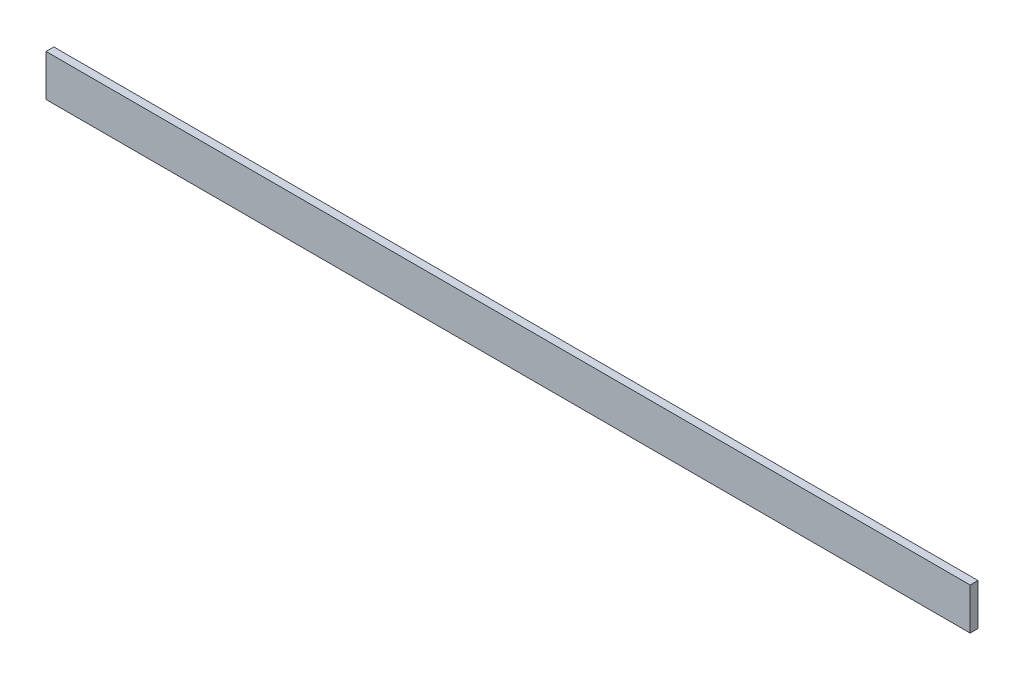
ISO-10303-21;
HEADER;
FILE_DESCRIPTION(('STEP AP214'),'2;1');
FILE_NAME('part.step','',(''),(''),'','','');
FILE_SCHEMA(('AUTOMOTIVE_DESIGN { 1 0 10303 214 1 1 1 1 }'));
ENDSEC;
DATA;
#1=APPLICATION_CONTEXT('core data for automotive mechanical design processes');
#2=APPLICATION_PROTOCOL_DEFINITION('international standard','automotive_design',2000,#1);
#3=PRODUCT_CONTEXT('',#1,'mechanical');
#4=PRODUCT('Part','Part','',(#3));
#5=PRODUCT_RELATED_PRODUCT_CATEGORY('part','',(#4));
#6=PRODUCT_DEFINITION_FORMATION('','',#4);
#7=PRODUCT_DEFINITION_CONTEXT('part definition',#1,'design');
#8=PRODUCT_DEFINITION('design','',#6,#7);
#9=PRODUCT_DEFINITION_SHAPE('','',#8);
#10=(LENGTH_UNIT() NAMED_UNIT(*) SI_UNIT(.MILLI.,.METRE.));
#11=(NAMED_UNIT(*) PLANE_ANGLE_UNIT() SI_UNIT($,.RADIAN.));
#12=(NAMED_UNIT(*) SI_UNIT($,.STERADIAN.) SOLID_ANGLE_UNIT());
#13=UNCERTAINTY_MEASURE_WITH_UNIT(LENGTH_MEASURE(1.E-05),#10,'distance_accuracy_value','');
#14=(GEOMETRIC_REPRESENTATION_CONTEXT(3) GLOBAL_UNCERTAINTY_ASSIGNED_CONTEXT((#13)) GLOBAL_UNIT_ASSIGNED_CONTEXT((#10,
#11,#12)) REPRESENTATION_CONTEXT('',''));
#15=CARTESIAN_POINT('',(0.,0.,0.));
#16=DIRECTION('',(0.,0.,1.));
#17=DIRECTION('',(1.,0.,0.));
#18=AXIS2_PLACEMENT_3D('',#15,#16,#17);
#19=CARTESIAN_POINT('',(0.,0.,9.525));
#20=DIRECTION('',(1.,0.,0.));
#21=DIRECTION('',(0.,0.,-1.));
#22=AXIS2_PLACEMENT_3D('',#19,#20,#21);
#23=PLANE('',#22);
#24=DIRECTION('',(0.,-1.,0.));
#25=VECTOR('',#24,1.);
#26=CARTESIAN_POINT('',(0.,0.,0.));
#27=LINE('',#26,#25);
#28=CARTESIAN_POINT('',(0.,50.8,0.));
#29=VERTEX_POINT('',#28);
#30=CARTESIAN_POINT('',(0.,0.,0.));
#31=VERTEX_POINT('',#30);
#32=EDGE_CURVE('E100',#29,#31,#27,.T.);
#33=ORIENTED_EDGE('',*,*,#32,.T.);
#34=DIRECTION('',(0.,0.,-1.));
#35=VECTOR('',#34,1.);
#36=CARTESIAN_POINT('',(0.,0.,9.525));
#37=LINE('',#36,#35);
#38=CARTESIAN_POINT('',(0.,0.,9.525));
#39=VERTEX_POINT('',#38);
#40=EDGE_CURVE('E11',#39,#31,#37,.T.);
#41=ORIENTED_EDGE('',*,*,#40,.F.);
#42=DIRECTION('',(0.,-1.,0.));
#43=VECTOR('',#42,1.);
#44=CARTESIAN_POINT('',(0.,0.,9.525));
#45=LINE('',#44,#43);
#46=CARTESIAN_POINT('',(0.,50.8,9.525));
#47=VERTEX_POINT('',#46);
#48=EDGE_CURVE('E88',#47,#39,#45,.T.);
#49=ORIENTED_EDGE('',*,*,#48,.F.);
#50=DIRECTION('',(0.,0.,-1.));
#51=VECTOR('',#50,1.);
#52=CARTESIAN_POINT('',(0.,50.8,9.525));
#53=LINE('',#52,#51);
#54=EDGE_CURVE('E96',#47,#29,#53,.T.);
#55=ORIENTED_EDGE('',*,*,#54,.T.);
#56=EDGE_LOOP('',(#33,#41,#49,#55));
#57=FACE_BOUND('',#56,.T.);
#58=ADVANCED_FACE('F37',(#57),#23,.F.);
#59=CARTESIAN_POINT('',(0.,0.,9.525));
#60=DIRECTION('',(0.,1.,0.));
#61=DIRECTION('',(0.,0.,1.));
#62=AXIS2_PLACEMENT_3D('',#59,#60,#61);
#63=PLANE('',#62);
#64=DIRECTION('',(1.,0.,0.));
#65=VECTOR('',#64,1.);
#66=CARTESIAN_POINT('',(0.,0.,0.));
#67=LINE('',#66,#65);
#68=CARTESIAN_POINT('',(1127.6,0.,0.));
#69=VERTEX_POINT('',#68);
#70=EDGE_CURVE('E92',#31,#69,#67,.T.);
#71=ORIENTED_EDGE('',*,*,#70,.T.);
#72=DIRECTION('',(0.,0.,-1.));
#73=VECTOR('',#72,1.);
#74=CARTESIAN_POINT('',(1127.6,0.,9.525));
#75=LINE('',#74,#73);
#76=CARTESIAN_POINT('',(1127.6,0.,9.525));
#77=VERTEX_POINT('',#76);
#78=EDGE_CURVE('E45',#77,#69,#75,.T.);
#79=ORIENTED_EDGE('',*,*,#78,.F.);
#80=DIRECTION('',(1.,0.,0.));
#81=VECTOR('',#80,1.);
#82=CARTESIAN_POINT('',(0.,0.,9.525));
#83=LINE('',#82,#81);
#84=EDGE_CURVE('E83',#39,#77,#83,.T.);
#85=ORIENTED_EDGE('',*,*,#84,.F.);
#86=ORIENTED_EDGE('',*,*,#40,.T.);
#87=EDGE_LOOP('',(#71,#79,#85,#86));
#88=FACE_BOUND('',#87,.T.);
#89=ADVANCED_FACE('F91',(#88),#63,.F.);
#90=CARTESIAN_POINT('',(1127.6,0.,9.525));
#91=DIRECTION('',(-1.,0.,0.));
#92=DIRECTION('',(0.,0.,1.));
#93=AXIS2_PLACEMENT_3D('',#90,#91,#92);
#94=PLANE('',#93);
#95=DIRECTION('',(0.,1.,0.));
#96=VECTOR('',#95,1.);
#97=CARTESIAN_POINT('',(1127.6,0.,0.));
#98=LINE('',#97,#96);
#99=CARTESIAN_POINT('',(1127.6,50.8,0.));
#100=VERTEX_POINT('',#99);
#101=EDGE_CURVE('E70',#69,#100,#98,.T.);
#102=ORIENTED_EDGE('',*,*,#101,.T.);
#103=DIRECTION('',(0.,0.,-1.));
#104=VECTOR('',#103,1.);
#105=CARTESIAN_POINT('',(1127.6,50.8,9.525));
#106=LINE('',#105,#104);
#107=CARTESIAN_POINT('',(1127.6,50.8,9.525));
#108=VERTEX_POINT('',#107);
#109=EDGE_CURVE('E93',#108,#100,#106,.T.);
#110=ORIENTED_EDGE('',*,*,#109,.F.);
#111=DIRECTION('',(0.,1.,0.));
#112=VECTOR('',#111,1.);
#113=CARTESIAN_POINT('',(1127.6,0.,9.525));
#114=LINE('',#113,#112);
#115=EDGE_CURVE('E86',#77,#108,#114,.T.);
#116=ORIENTED_EDGE('',*,*,#115,.F.);
#117=ORIENTED_EDGE('',*,*,#78,.T.);
#118=EDGE_LOOP('',(#102,#110,#116,#117));
#119=FACE_BOUND('',#118,.T.);
#120=ADVANCED_FACE('F94',(#119),#94,.F.);
#121=CARTESIAN_POINT('',(0.,50.8,9.525));
#122=DIRECTION('',(0.,-1.,0.));
#123=DIRECTION('',(0.,0.,-1.));
#124=AXIS2_PLACEMENT_3D('',#121,#122,#123);
#125=PLANE('',#124);
#126=DIRECTION('',(-1.,0.,0.));
#127=VECTOR('',#126,1.);
#128=CARTESIAN_POINT('',(0.,50.8,0.));
#129=LINE('',#128,#127);
#130=EDGE_CURVE('E76',#100,#29,#129,.T.);
#131=ORIENTED_EDGE('',*,*,#130,.T.);
#132=ORIENTED_EDGE('',*,*,#54,.F.);
#133=DIRECTION('',(-1.,0.,0.));
#134=VECTOR('',#133,1.);
#135=CARTESIAN_POINT('',(0.,50.8,9.525));
#136=LINE('',#135,#134);
#137=EDGE_CURVE('E53',#108,#47,#136,.T.);
#138=ORIENTED_EDGE('',*,*,#137,.F.);
#139=ORIENTED_EDGE('',*,*,#109,.T.);
#140=EDGE_LOOP('',(#131,#132,#138,#139));
#141=FACE_BOUND('',#140,.T.);
#142=ADVANCED_FACE('F107',(#141),#125,.F.);
#143=CARTESIAN_POINT('',(0.,0.,9.525));
#144=DIRECTION('',(0.,0.,-1.));
#145=DIRECTION('',(-1.,0.,0.));
#146=AXIS2_PLACEMENT_3D('',#143,#144,#145);
#147=PLANE('',#146);
#148=ORIENTED_EDGE('',*,*,#48,.T.);
#149=ORIENTED_EDGE('',*,*,#84,.T.);
#150=ORIENTED_EDGE('',*,*,#115,.T.);
#151=ORIENTED_EDGE('',*,*,#137,.T.);
#152=EDGE_LOOP('',(#148,#149,#150,#151));
#153=FACE_BOUND('',#152,.T.);
#154=ADVANCED_FACE('F84',(#153),#147,.F.);
#155=CARTESIAN_POINT('',(0.,0.,0.));
#156=DIRECTION('',(0.,0.,-1.));
#157=DIRECTION('',(-1.,0.,0.));
#158=AXIS2_PLACEMENT_3D('',#155,#156,#157);
#159=PLANE('',#158);
#160=ORIENTED_EDGE('',*,*,#32,.F.);
#161=ORIENTED_EDGE('',*,*,#130,.F.);
#162=ORIENTED_EDGE('',*,*,#101,.F.);
#163=ORIENTED_EDGE('',*,*,#70,.F.);
#164=EDGE_LOOP('',(#160,#161,#162,#163));
#165=FACE_BOUND('',#164,.T.);
#166=ADVANCED_FACE('F110',(#165),#159,.T.);
#167=CLOSED_SHELL('',(#58,#89,#120,#142,#154,#166));
#168=MANIFOLD_SOLID_BREP('B2',#167);
#169=ADVANCED_BREP_SHAPE_REPRESENTATION('',(#18,#168),#14);
#170=SHAPE_DEFINITION_REPRESENTATION(#9,#169);
ENDSEC;
END-ISO-10303-21;
